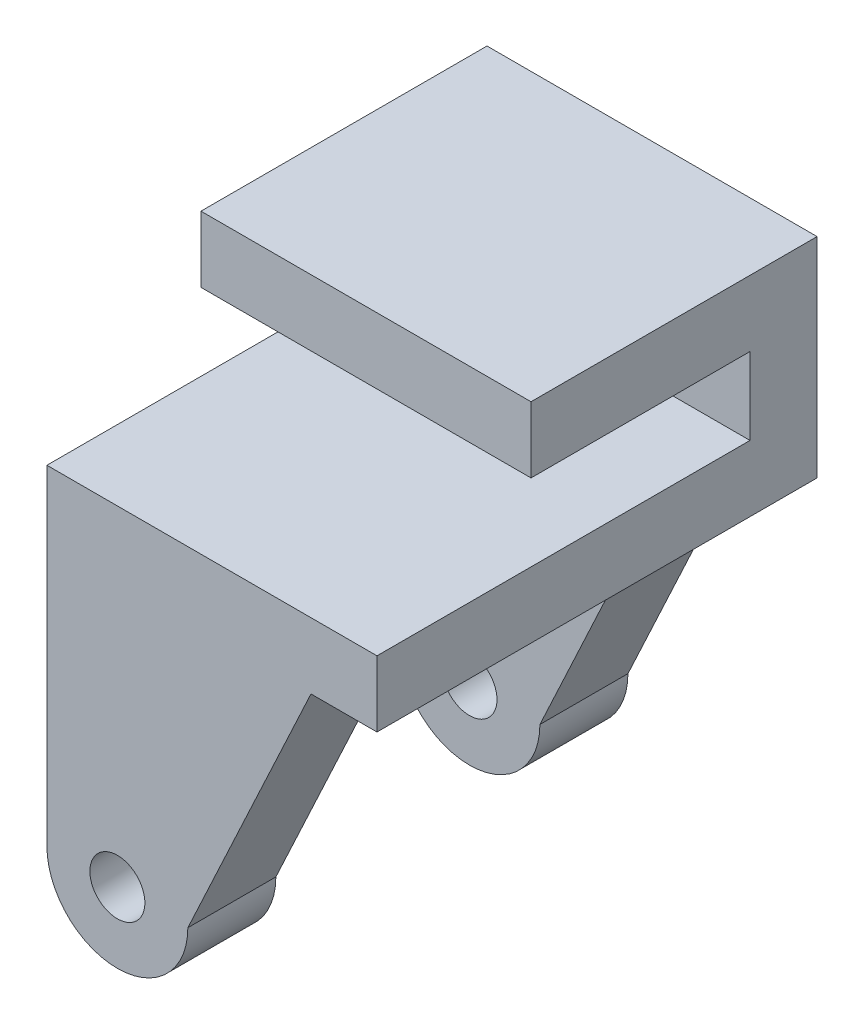
ISO-10303-21;
HEADER;
FILE_DESCRIPTION(('STEP AP214'),'2;1');
FILE_NAME('part.step','',(''),(''),'','','');
FILE_SCHEMA(('AUTOMOTIVE_DESIGN { 1 0 10303 214 1 1 1 1 }'));
ENDSEC;
DATA;
#1=APPLICATION_CONTEXT('core data for automotive mechanical design processes');
#2=APPLICATION_PROTOCOL_DEFINITION('international standard','automotive_design',2000,#1);
#3=PRODUCT_CONTEXT('',#1,'mechanical');
#4=PRODUCT('Part','Part','',(#3));
#5=PRODUCT_RELATED_PRODUCT_CATEGORY('part','',(#4));
#6=PRODUCT_DEFINITION_FORMATION('','',#4);
#7=PRODUCT_DEFINITION_CONTEXT('part definition',#1,'design');
#8=PRODUCT_DEFINITION('design','',#6,#7);
#9=PRODUCT_DEFINITION_SHAPE('','',#8);
#10=(LENGTH_UNIT() NAMED_UNIT(*) SI_UNIT(.MILLI.,.METRE.));
#11=(NAMED_UNIT(*) PLANE_ANGLE_UNIT() SI_UNIT($,.RADIAN.));
#12=(NAMED_UNIT(*) SI_UNIT($,.STERADIAN.) SOLID_ANGLE_UNIT());
#13=UNCERTAINTY_MEASURE_WITH_UNIT(LENGTH_MEASURE(1.E-05),#10,'distance_accuracy_value','');
#14=(GEOMETRIC_REPRESENTATION_CONTEXT(3) GLOBAL_UNCERTAINTY_ASSIGNED_CONTEXT((#13)) GLOBAL_UNIT_ASSIGNED_CONTEXT((#10,
#11,#12)) REPRESENTATION_CONTEXT('',''));
#15=CARTESIAN_POINT('',(0.,0.,0.));
#16=DIRECTION('',(0.,0.,1.));
#17=DIRECTION('',(1.,0.,0.));
#18=AXIS2_PLACEMENT_3D('',#15,#16,#17);
#19=CARTESIAN_POINT('',(15.,0.,0.));
#20=DIRECTION('',(0.,1.,0.));
#21=DIRECTION('',(0.,0.,1.));
#22=AXIS2_PLACEMENT_3D('',#19,#20,#21);
#23=PLANE('',#22);
#24=DIRECTION('',(0.,0.,-1.));
#25=VECTOR('',#24,1.);
#26=CARTESIAN_POINT('',(15.,0.,0.));
#27=LINE('',#26,#25);
#28=CARTESIAN_POINT('',(15.,0.,-20.));
#29=VERTEX_POINT('',#28);
#30=CARTESIAN_POINT('',(15.,0.,-40.));
#31=VERTEX_POINT('',#30);
#32=EDGE_CURVE('E11',#29,#31,#27,.T.);
#33=ORIENTED_EDGE('',*,*,#32,.F.);
#34=DIRECTION('',(-1.,0.,0.));
#35=VECTOR('',#34,1.);
#36=CARTESIAN_POINT('',(15.,0.,-20.));
#37=LINE('',#36,#35);
#38=CARTESIAN_POINT('',(12.,0.,-20.));
#39=VERTEX_POINT('',#38);
#40=EDGE_CURVE('E152',#29,#39,#37,.T.);
#41=ORIENTED_EDGE('',*,*,#40,.T.);
#42=DIRECTION('',(0.,0.,-1.));
#43=VECTOR('',#42,1.);
#44=CARTESIAN_POINT('',(12.,0.,-16.));
#45=LINE('',#44,#43);
#46=CARTESIAN_POINT('',(12.,0.,-24.));
#47=VERTEX_POINT('',#46);
#48=EDGE_CURVE('E162',#39,#47,#45,.T.);
#49=ORIENTED_EDGE('',*,*,#48,.T.);
#50=DIRECTION('',(-1.,0.,0.));
#51=VECTOR('',#50,1.);
#52=CARTESIAN_POINT('',(0.,0.,-24.));
#53=LINE('',#52,#51);
#54=CARTESIAN_POINT('',(0.,0.,-24.));
#55=VERTEX_POINT('',#54);
#56=EDGE_CURVE('E259',#47,#55,#53,.T.);
#57=ORIENTED_EDGE('',*,*,#56,.T.);
#58=DIRECTION('',(0.,0.,1.));
#59=VECTOR('',#58,1.);
#60=CARTESIAN_POINT('',(0.,0.,-40.));
#61=LINE('',#60,#59);
#62=CARTESIAN_POINT('',(0.,0.,-36.));
#63=VERTEX_POINT('',#62);
#64=EDGE_CURVE('E234',#63,#55,#61,.T.);
#65=ORIENTED_EDGE('',*,*,#64,.F.);
#66=DIRECTION('',(-1.,0.,0.));
#67=VECTOR('',#66,1.);
#68=CARTESIAN_POINT('',(0.,0.,-36.));
#69=LINE('',#68,#67);
#70=CARTESIAN_POINT('',(12.,0.,-36.));
#71=VERTEX_POINT('',#70);
#72=EDGE_CURVE('E277',#71,#63,#69,.T.);
#73=ORIENTED_EDGE('',*,*,#72,.F.);
#74=DIRECTION('',(0.,0.,-1.));
#75=VECTOR('',#74,1.);
#76=CARTESIAN_POINT('',(12.,0.,-36.));
#77=LINE('',#76,#75);
#78=CARTESIAN_POINT('',(12.,0.,-40.));
#79=VERTEX_POINT('',#78);
#80=EDGE_CURVE('E291',#71,#79,#77,.T.);
#81=ORIENTED_EDGE('',*,*,#80,.T.);
#82=DIRECTION('',(-1.,0.,0.));
#83=VECTOR('',#82,1.);
#84=CARTESIAN_POINT('',(15.,0.,-40.));
#85=LINE('',#84,#83);
#86=EDGE_CURVE('E181',#31,#79,#85,.T.);
#87=ORIENTED_EDGE('',*,*,#86,.F.);
#88=EDGE_LOOP('',(#33,#41,#49,#57,#65,#73,#81,#87));
#89=FACE_BOUND('',#88,.T.);
#90=ADVANCED_FACE('F39',(#89),#23,.F.);
#91=CARTESIAN_POINT('',(15.,0.,0.));
#92=DIRECTION('',(-1.,0.,0.));
#93=DIRECTION('',(0.,0.,1.));
#94=AXIS2_PLACEMENT_3D('',#91,#92,#93);
#95=PLANE('',#94);
#96=DIRECTION('',(0.,0.,1.));
#97=VECTOR('',#96,1.);
#98=CARTESIAN_POINT('',(15.,3.,0.));
#99=LINE('',#98,#97);
#100=CARTESIAN_POINT('',(15.,3.,-36.9524790088301));
#101=VERTEX_POINT('',#100);
#102=CARTESIAN_POINT('',(15.,3.,-20.));
#103=VERTEX_POINT('',#102);
#104=EDGE_CURVE('E48',#101,#103,#99,.T.);
#105=ORIENTED_EDGE('',*,*,#104,.T.);
#106=DIRECTION('',(0.,-1.,0.));
#107=VECTOR('',#106,1.);
#108=CARTESIAN_POINT('',(15.,0.,-20.));
#109=LINE('',#108,#107);
#110=EDGE_CURVE('E192',#103,#29,#109,.T.);
#111=ORIENTED_EDGE('',*,*,#110,.T.);
#112=ORIENTED_EDGE('',*,*,#32,.T.);
#113=DIRECTION('',(0.,1.,0.));
#114=VECTOR('',#113,1.);
#115=CARTESIAN_POINT('',(15.,0.,-40.));
#116=LINE('',#115,#114);
#117=CARTESIAN_POINT('',(15.,9.5,-40.));
#118=VERTEX_POINT('',#117);
#119=EDGE_CURVE('E226',#31,#118,#116,.T.);
#120=ORIENTED_EDGE('',*,*,#119,.T.);
#121=DIRECTION('',(0.,0.,1.));
#122=VECTOR('',#121,1.);
#123=CARTESIAN_POINT('',(15.,9.5,-40.));
#124=LINE('',#123,#122);
#125=CARTESIAN_POINT('',(15.,9.5,-27.));
#126=VERTEX_POINT('',#125);
#127=EDGE_CURVE('E64',#118,#126,#124,.T.);
#128=ORIENTED_EDGE('',*,*,#127,.T.);
#129=DIRECTION('',(0.,1.,0.));
#130=VECTOR('',#129,1.);
#131=CARTESIAN_POINT('',(15.,0.,-27.));
#132=LINE('',#131,#130);
#133=CARTESIAN_POINT('',(15.,6.5,-27.));
#134=VERTEX_POINT('',#133);
#135=EDGE_CURVE('E216',#134,#126,#132,.T.);
#136=ORIENTED_EDGE('',*,*,#135,.F.);
#137=DIRECTION('',(0.,0.,1.));
#138=VECTOR('',#137,1.);
#139=CARTESIAN_POINT('',(15.,6.5,0.));
#140=LINE('',#139,#138);
#141=CARTESIAN_POINT('',(15.,6.5,-36.9524790088301));
#142=VERTEX_POINT('',#141);
#143=EDGE_CURVE('E222',#142,#134,#140,.T.);
#144=ORIENTED_EDGE('',*,*,#143,.F.);
#145=DIRECTION('',(0.,1.,0.));
#146=VECTOR('',#145,1.);
#147=CARTESIAN_POINT('',(15.,0.,-36.9524790088301));
#148=LINE('',#147,#146);
#149=EDGE_CURVE('E82',#101,#142,#148,.T.);
#150=ORIENTED_EDGE('',*,*,#149,.F.);
#151=EDGE_LOOP('',(#105,#111,#112,#120,#128,#136,#144,#150));
#152=FACE_BOUND('',#151,.T.);
#153=ADVANCED_FACE('F191',(#152),#95,.F.);
#154=CARTESIAN_POINT('',(0.,0.,0.));
#155=DIRECTION('',(-1.,0.,0.));
#156=DIRECTION('',(0.,0.,1.));
#157=AXIS2_PLACEMENT_3D('',#154,#155,#156);
#158=PLANE('',#157);
#159=DIRECTION('',(0.,-1.,0.));
#160=VECTOR('',#159,1.);
#161=CARTESIAN_POINT('',(0.,0.,-20.));
#162=LINE('',#161,#160);
#163=CARTESIAN_POINT('',(0.,3.,-20.));
#164=VERTEX_POINT('',#163);
#165=CARTESIAN_POINT('',(0.,-12.,-20.));
#166=VERTEX_POINT('',#165);
#167=EDGE_CURVE('E167',#164,#166,#162,.T.);
#168=ORIENTED_EDGE('',*,*,#167,.F.);
#169=DIRECTION('',(0.,0.,-1.));
#170=VECTOR('',#169,1.);
#171=CARTESIAN_POINT('',(0.,3.,-20.));
#172=LINE('',#171,#170);
#173=CARTESIAN_POINT('',(0.,3.,-36.9524790088301));
#174=VERTEX_POINT('',#173);
#175=EDGE_CURVE('E185',#164,#174,#172,.T.);
#176=ORIENTED_EDGE('',*,*,#175,.T.);
#177=DIRECTION('',(0.,-1.,0.));
#178=VECTOR('',#177,1.);
#179=CARTESIAN_POINT('',(0.,3.,-36.9524790088301));
#180=LINE('',#179,#178);
#181=CARTESIAN_POINT('',(0.,6.5,-36.9524790088301));
#182=VERTEX_POINT('',#181);
#183=EDGE_CURVE('E203',#182,#174,#180,.T.);
#184=ORIENTED_EDGE('',*,*,#183,.F.);
#185=DIRECTION('',(0.,0.,-1.));
#186=VECTOR('',#185,1.);
#187=CARTESIAN_POINT('',(0.,6.5,-27.));
#188=LINE('',#187,#186);
#189=CARTESIAN_POINT('',(0.,6.5,-27.));
#190=VERTEX_POINT('',#189);
#191=EDGE_CURVE('E212',#190,#182,#188,.T.);
#192=ORIENTED_EDGE('',*,*,#191,.F.);
#193=DIRECTION('',(0.,-1.,0.));
#194=VECTOR('',#193,1.);
#195=CARTESIAN_POINT('',(0.,6.5,-27.));
#196=LINE('',#195,#194);
#197=CARTESIAN_POINT('',(0.,9.5,-27.));
#198=VERTEX_POINT('',#197);
#199=EDGE_CURVE('E206',#198,#190,#196,.T.);
#200=ORIENTED_EDGE('',*,*,#199,.F.);
#201=DIRECTION('',(0.,0.,1.));
#202=VECTOR('',#201,1.);
#203=CARTESIAN_POINT('',(0.,9.5,-40.));
#204=LINE('',#203,#202);
#205=CARTESIAN_POINT('',(0.,9.5,-40.));
#206=VERTEX_POINT('',#205);
#207=EDGE_CURVE('E75',#206,#198,#204,.T.);
#208=ORIENTED_EDGE('',*,*,#207,.F.);
#209=DIRECTION('',(0.,1.,0.));
#210=VECTOR('',#209,1.);
#211=CARTESIAN_POINT('',(0.,0.,-40.));
#212=LINE('',#211,#210);
#213=CARTESIAN_POINT('',(0.,-12.,-40.));
#214=VERTEX_POINT('',#213);
#215=EDGE_CURVE('E225',#214,#206,#212,.T.);
#216=ORIENTED_EDGE('',*,*,#215,.F.);
#217=DIRECTION('',(0.,0.,-1.));
#218=VECTOR('',#217,1.);
#219=CARTESIAN_POINT('',(0.,-12.,-36.));
#220=LINE('',#219,#218);
#221=CARTESIAN_POINT('',(0.,-12.,-36.));
#222=VERTEX_POINT('',#221);
#223=EDGE_CURVE('E296',#222,#214,#220,.T.);
#224=ORIENTED_EDGE('',*,*,#223,.F.);
#225=DIRECTION('',(0.,-1.,0.));
#226=VECTOR('',#225,1.);
#227=CARTESIAN_POINT('',(0.,0.,-36.));
#228=LINE('',#227,#226);
#229=EDGE_CURVE('E288',#63,#222,#228,.T.);
#230=ORIENTED_EDGE('',*,*,#229,.F.);
#231=ORIENTED_EDGE('',*,*,#64,.T.);
#232=DIRECTION('',(0.,-1.,0.));
#233=VECTOR('',#232,1.);
#234=CARTESIAN_POINT('',(0.,0.,-24.));
#235=LINE('',#234,#233);
#236=CARTESIAN_POINT('',(0.,-12.,-24.));
#237=VERTEX_POINT('',#236);
#238=EDGE_CURVE('E253',#55,#237,#235,.T.);
#239=ORIENTED_EDGE('',*,*,#238,.T.);
#240=DIRECTION('',(0.,0.,-1.));
#241=VECTOR('',#240,1.);
#242=CARTESIAN_POINT('',(0.,-12.,-16.));
#243=LINE('',#242,#241);
#244=EDGE_CURVE('E179',#166,#237,#243,.T.);
#245=ORIENTED_EDGE('',*,*,#244,.F.);
#246=EDGE_LOOP('',(#168,#176,#184,#192,#200,#208,#216,#224,#230,#231,#239,#245));
#247=FACE_BOUND('',#246,.T.);
#248=ADVANCED_FACE('F256',(#247),#158,.T.);
#249=CARTESIAN_POINT('',(15.,9.5,-40.));
#250=DIRECTION('',(0.,-1.,0.));
#251=DIRECTION('',(0.,0.,-1.));
#252=AXIS2_PLACEMENT_3D('',#249,#250,#251);
#253=PLANE('',#252);
#254=DIRECTION('',(1.,0.,0.));
#255=VECTOR('',#254,1.);
#256=CARTESIAN_POINT('',(0.,9.5,-27.));
#257=LINE('',#256,#255);
#258=EDGE_CURVE('E219',#198,#126,#257,.T.);
#259=ORIENTED_EDGE('',*,*,#258,.T.);
#260=ORIENTED_EDGE('',*,*,#127,.F.);
#261=DIRECTION('',(-1.,0.,0.));
#262=VECTOR('',#261,1.);
#263=CARTESIAN_POINT('',(15.,9.5,-40.));
#264=LINE('',#263,#262);
#265=EDGE_CURVE('E175',#118,#206,#264,.T.);
#266=ORIENTED_EDGE('',*,*,#265,.T.);
#267=ORIENTED_EDGE('',*,*,#207,.T.);
#268=EDGE_LOOP('',(#259,#260,#266,#267));
#269=FACE_BOUND('',#268,.T.);
#270=ADVANCED_FACE('F326',(#269),#253,.F.);
#271=CARTESIAN_POINT('',(0.,3.,-20.));
#272=DIRECTION('',(0.,-1.,0.));
#273=DIRECTION('',(0.,0.,-1.));
#274=AXIS2_PLACEMENT_3D('',#271,#272,#273);
#275=PLANE('',#274);
#276=ORIENTED_EDGE('',*,*,#175,.F.);
#277=DIRECTION('',(1.,0.,0.));
#278=VECTOR('',#277,1.);
#279=CARTESIAN_POINT('',(0.,3.,-20.));
#280=LINE('',#279,#278);
#281=EDGE_CURVE('E166',#164,#103,#280,.T.);
#282=ORIENTED_EDGE('',*,*,#281,.T.);
#283=ORIENTED_EDGE('',*,*,#104,.F.);
#284=DIRECTION('',(1.,0.,0.));
#285=VECTOR('',#284,1.);
#286=CARTESIAN_POINT('',(0.,3.,-36.9524790088301));
#287=LINE('',#286,#285);
#288=EDGE_CURVE('E199',#174,#101,#287,.T.);
#289=ORIENTED_EDGE('',*,*,#288,.F.);
#290=EDGE_LOOP('',(#276,#282,#283,#289));
#291=FACE_BOUND('',#290,.T.);
#292=ADVANCED_FACE('F198',(#291),#275,.F.);
#293=CARTESIAN_POINT('',(3.20215405107003,-12.,-16.));
#294=DIRECTION('',(0.,0.,-1.));
#295=DIRECTION('',(-1.,0.,0.));
#296=AXIS2_PLACEMENT_3D('',#293,#294,#295);
#297=CYLINDRICAL_SURFACE('',#296,3.20215405107003);
#298=DIRECTION('',(0.,0.,-1.));
#299=VECTOR('',#298,1.);
#300=CARTESIAN_POINT('',(6.40430810214006,-12.,-16.));
#301=LINE('',#300,#299);
#302=CARTESIAN_POINT('',(6.40430810214006,-12.,-20.));
#303=VERTEX_POINT('',#302);
#304=CARTESIAN_POINT('',(6.40430810214006,-12.,-24.));
#305=VERTEX_POINT('',#304);
#306=EDGE_CURVE('E174',#303,#305,#301,.T.);
#307=ORIENTED_EDGE('',*,*,#306,.F.);
#308=CARTESIAN_POINT('',(3.20215405107003,-12.,-20.));
#309=DIRECTION('',(0.,0.,-1.));
#310=DIRECTION('',(-1.,0.,0.));
#311=AXIS2_PLACEMENT_3D('',#308,#309,#310);
#312=CIRCLE('',#311,3.20215405107003);
#313=EDGE_CURVE('E55',#303,#166,#312,.T.);
#314=ORIENTED_EDGE('',*,*,#313,.T.);
#315=ORIENTED_EDGE('',*,*,#244,.T.);
#316=CARTESIAN_POINT('',(3.20215405107003,-12.,-24.));
#317=DIRECTION('',(0.,0.,1.));
#318=DIRECTION('',(1.,0.,0.));
#319=AXIS2_PLACEMENT_3D('',#316,#317,#318);
#320=CIRCLE('',#319,3.20215405107003);
#321=EDGE_CURVE('E248',#237,#305,#320,.T.);
#322=ORIENTED_EDGE('',*,*,#321,.T.);
#323=EDGE_LOOP('',(#307,#314,#315,#322));
#324=FACE_BOUND('',#323,.T.);
#325=ADVANCED_FACE('F247',(#324),#297,.T.);
#326=CARTESIAN_POINT('',(12.,0.,-16.));
#327=DIRECTION('',(-0.906307787036651,0.422618261740696,0.));
#328=DIRECTION('',(-0.422618261740697,-0.906307787036651,0.));
#329=AXIS2_PLACEMENT_3D('',#326,#327,#328);
#330=PLANE('',#329);
#331=ORIENTED_EDGE('',*,*,#48,.F.);
#332=DIRECTION('',(-0.422618261740697,-0.906307787036651,0.));
#333=VECTOR('',#332,1.);
#334=CARTESIAN_POINT('',(12.,0.,-20.));
#335=LINE('',#334,#333);
#336=EDGE_CURVE('E149',#39,#303,#335,.T.);
#337=ORIENTED_EDGE('',*,*,#336,.T.);
#338=ORIENTED_EDGE('',*,*,#306,.T.);
#339=DIRECTION('',(0.422618261740696,0.906307787036651,0.));
#340=VECTOR('',#339,1.);
#341=CARTESIAN_POINT('',(12.,0.,-24.));
#342=LINE('',#341,#340);
#343=EDGE_CURVE('E172',#305,#47,#342,.T.);
#344=ORIENTED_EDGE('',*,*,#343,.T.);
#345=EDGE_LOOP('',(#331,#337,#338,#344));
#346=FACE_BOUND('',#345,.T.);
#347=ADVANCED_FACE('F170',(#346),#330,.F.);
#348=CARTESIAN_POINT('',(3.20215405107003,-12.,-16.));
#349=DIRECTION('',(0.,0.,-1.));
#350=DIRECTION('',(-1.,0.,0.));
#351=AXIS2_PLACEMENT_3D('',#348,#349,#350);
#352=CYLINDRICAL_SURFACE('',#351,1.25);
#353=CARTESIAN_POINT('',(3.20215405107003,-12.,-20.));
#354=DIRECTION('',(0.,0.,-1.));
#355=DIRECTION('',(-1.,0.,0.));
#356=AXIS2_PLACEMENT_3D('',#353,#354,#355);
#357=CIRCLE('',#356,1.25);
#358=CARTESIAN_POINT('',(1.95215405107003,-12.,-20.));
#359=VERTEX_POINT('',#358);
#360=EDGE_CURVE('E42',#359,#359,#357,.T.);
#361=ORIENTED_EDGE('',*,*,#360,.F.);
#362=EDGE_LOOP('',(#361));
#363=FACE_BOUND('',#362,.T.);
#364=CARTESIAN_POINT('',(3.20215405107003,-12.,-24.));
#365=DIRECTION('',(0.,0.,1.));
#366=DIRECTION('',(1.,0.,0.));
#367=AXIS2_PLACEMENT_3D('',#364,#365,#366);
#368=CIRCLE('',#367,1.25);
#369=CARTESIAN_POINT('',(4.45215405107003,-12.,-24.));
#370=VERTEX_POINT('',#369);
#371=EDGE_CURVE('E262',#370,#370,#368,.T.);
#372=ORIENTED_EDGE('',*,*,#371,.F.);
#373=EDGE_LOOP('',(#372));
#374=FACE_BOUND('',#373,.T.);
#375=ADVANCED_FACE('F335',(#363,#374),#352,.F.);
#376=CARTESIAN_POINT('',(15.,0.,-40.));
#377=DIRECTION('',(0.,0.,1.));
#378=DIRECTION('',(1.,0.,0.));
#379=AXIS2_PLACEMENT_3D('',#376,#377,#378);
#380=PLANE('',#379);
#381=ORIENTED_EDGE('',*,*,#215,.T.);
#382=ORIENTED_EDGE('',*,*,#265,.F.);
#383=ORIENTED_EDGE('',*,*,#119,.F.);
#384=ORIENTED_EDGE('',*,*,#86,.T.);
#385=DIRECTION('',(0.422618261740696,0.906307787036651,0.));
#386=VECTOR('',#385,1.);
#387=CARTESIAN_POINT('',(12.,0.,-40.));
#388=LINE('',#387,#386);
#389=CARTESIAN_POINT('',(6.40430810214006,-12.,-40.));
#390=VERTEX_POINT('',#389);
#391=EDGE_CURVE('E273',#390,#79,#388,.T.);
#392=ORIENTED_EDGE('',*,*,#391,.F.);
#393=CARTESIAN_POINT('',(3.20215405107003,-12.,-40.));
#394=DIRECTION('',(0.,0.,1.));
#395=DIRECTION('',(1.,0.,0.));
#396=AXIS2_PLACEMENT_3D('',#393,#394,#395);
#397=CIRCLE('',#396,3.20215405107003);
#398=EDGE_CURVE('E282',#214,#390,#397,.T.);
#399=ORIENTED_EDGE('',*,*,#398,.F.);
#400=EDGE_LOOP('',(#381,#382,#383,#384,#392,#399));
#401=FACE_BOUND('',#400,.T.);
#402=CARTESIAN_POINT('',(3.20215405107003,-12.,-40.));
#403=DIRECTION('',(0.,0.,1.));
#404=DIRECTION('',(1.,0.,0.));
#405=AXIS2_PLACEMENT_3D('',#402,#403,#404);
#406=CIRCLE('',#405,1.25);
#407=CARTESIAN_POINT('',(4.45215405107003,-12.,-40.));
#408=VERTEX_POINT('',#407);
#409=EDGE_CURVE('E268',#408,#408,#406,.T.);
#410=ORIENTED_EDGE('',*,*,#409,.T.);
#411=EDGE_LOOP('',(#410));
#412=FACE_BOUND('',#411,.T.);
#413=ADVANCED_FACE('F323',(#401,#412),#380,.F.);
#414=CARTESIAN_POINT('',(0.,6.5,-27.));
#415=DIRECTION('',(0.,-1.,0.));
#416=DIRECTION('',(0.,0.,-1.));
#417=AXIS2_PLACEMENT_3D('',#414,#415,#416);
#418=PLANE('',#417);
#419=ORIENTED_EDGE('',*,*,#143,.T.);
#420=DIRECTION('',(1.,0.,0.));
#421=VECTOR('',#420,1.);
#422=CARTESIAN_POINT('',(0.,6.5,-27.));
#423=LINE('',#422,#421);
#424=EDGE_CURVE('E210',#190,#134,#423,.T.);
#425=ORIENTED_EDGE('',*,*,#424,.F.);
#426=ORIENTED_EDGE('',*,*,#191,.T.);
#427=DIRECTION('',(1.,0.,0.));
#428=VECTOR('',#427,1.);
#429=CARTESIAN_POINT('',(0.,6.5,-36.9524790088301));
#430=LINE('',#429,#428);
#431=EDGE_CURVE('E205',#182,#142,#430,.T.);
#432=ORIENTED_EDGE('',*,*,#431,.T.);
#433=EDGE_LOOP('',(#419,#425,#426,#432));
#434=FACE_BOUND('',#433,.T.);
#435=ADVANCED_FACE('F327',(#434),#418,.T.);
#436=CARTESIAN_POINT('',(0.,3.,-36.9524790088301));
#437=DIRECTION('',(0.,0.,1.));
#438=DIRECTION('',(0.,-1.,0.));
#439=AXIS2_PLACEMENT_3D('',#436,#437,#438);
#440=PLANE('',#439);
#441=ORIENTED_EDGE('',*,*,#149,.T.);
#442=ORIENTED_EDGE('',*,*,#431,.F.);
#443=ORIENTED_EDGE('',*,*,#183,.T.);
#444=ORIENTED_EDGE('',*,*,#288,.T.);
#445=EDGE_LOOP('',(#441,#442,#443,#444));
#446=FACE_BOUND('',#445,.T.);
#447=ADVANCED_FACE('F201',(#446),#440,.T.);
#448=CARTESIAN_POINT('',(0.,6.5,-27.));
#449=DIRECTION('',(0.,0.,1.));
#450=DIRECTION('',(1.,0.,0.));
#451=AXIS2_PLACEMENT_3D('',#448,#449,#450);
#452=PLANE('',#451);
#453=ORIENTED_EDGE('',*,*,#135,.T.);
#454=ORIENTED_EDGE('',*,*,#258,.F.);
#455=ORIENTED_EDGE('',*,*,#199,.T.);
#456=ORIENTED_EDGE('',*,*,#424,.T.);
#457=EDGE_LOOP('',(#453,#454,#455,#456));
#458=FACE_BOUND('',#457,.T.);
#459=ADVANCED_FACE('F317',(#458),#452,.T.);
#460=CARTESIAN_POINT('',(3.20215405107003,-12.,-36.));
#461=DIRECTION('',(0.,0.,-1.));
#462=DIRECTION('',(1.,0.,0.));
#463=AXIS2_PLACEMENT_3D('',#460,#461,#462);
#464=PLANE('',#463);
#465=ORIENTED_EDGE('',*,*,#72,.T.);
#466=ORIENTED_EDGE('',*,*,#229,.T.);
#467=CARTESIAN_POINT('',(3.20215405107003,-12.,-36.));
#468=DIRECTION('',(0.,0.,1.));
#469=DIRECTION('',(1.,0.,0.));
#470=AXIS2_PLACEMENT_3D('',#467,#468,#469);
#471=CIRCLE('',#470,3.20215405107003);
#472=CARTESIAN_POINT('',(6.40430810214006,-12.,-36.));
#473=VERTEX_POINT('',#472);
#474=EDGE_CURVE('E285',#222,#473,#471,.T.);
#475=ORIENTED_EDGE('',*,*,#474,.T.);
#476=DIRECTION('',(0.422618261740696,0.906307787036651,0.));
#477=VECTOR('',#476,1.);
#478=CARTESIAN_POINT('',(12.,0.,-36.));
#479=LINE('',#478,#477);
#480=EDGE_CURVE('E281',#473,#71,#479,.T.);
#481=ORIENTED_EDGE('',*,*,#480,.T.);
#482=EDGE_LOOP('',(#465,#466,#475,#481));
#483=FACE_BOUND('',#482,.T.);
#484=CARTESIAN_POINT('',(3.20215405107003,-12.,-36.));
#485=DIRECTION('',(0.,0.,1.));
#486=DIRECTION('',(1.,0.,0.));
#487=AXIS2_PLACEMENT_3D('',#484,#485,#486);
#488=CIRCLE('',#487,1.25);
#489=CARTESIAN_POINT('',(4.45215405107003,-12.,-36.));
#490=VERTEX_POINT('',#489);
#491=EDGE_CURVE('E269',#490,#490,#488,.T.);
#492=ORIENTED_EDGE('',*,*,#491,.F.);
#493=EDGE_LOOP('',(#492));
#494=FACE_BOUND('',#493,.T.);
#495=ADVANCED_FACE('F404',(#483,#494),#464,.F.);
#496=CARTESIAN_POINT('',(3.20215405107003,-12.,-36.));
#497=DIRECTION('',(0.,0.,-1.));
#498=DIRECTION('',(-1.,0.,0.));
#499=AXIS2_PLACEMENT_3D('',#496,#497,#498);
#500=CYLINDRICAL_SURFACE('',#499,3.20215405107003);
#501=ORIENTED_EDGE('',*,*,#398,.T.);
#502=DIRECTION('',(0.,0.,-1.));
#503=VECTOR('',#502,1.);
#504=CARTESIAN_POINT('',(6.40430810214006,-12.,-36.));
#505=LINE('',#504,#503);
#506=EDGE_CURVE('E300',#473,#390,#505,.T.);
#507=ORIENTED_EDGE('',*,*,#506,.F.);
#508=ORIENTED_EDGE('',*,*,#474,.F.);
#509=ORIENTED_EDGE('',*,*,#223,.T.);
#510=EDGE_LOOP('',(#501,#507,#508,#509));
#511=FACE_BOUND('',#510,.T.);
#512=ADVANCED_FACE('F412',(#511),#500,.T.);
#513=CARTESIAN_POINT('',(12.,0.,-36.));
#514=DIRECTION('',(-0.906307787036651,0.422618261740696,0.));
#515=DIRECTION('',(-0.422618261740697,-0.906307787036651,0.));
#516=AXIS2_PLACEMENT_3D('',#513,#514,#515);
#517=PLANE('',#516);
#518=ORIENTED_EDGE('',*,*,#391,.T.);
#519=ORIENTED_EDGE('',*,*,#80,.F.);
#520=ORIENTED_EDGE('',*,*,#480,.F.);
#521=ORIENTED_EDGE('',*,*,#506,.T.);
#522=EDGE_LOOP('',(#518,#519,#520,#521));
#523=FACE_BOUND('',#522,.T.);
#524=ADVANCED_FACE('F422',(#523),#517,.F.);
#525=CARTESIAN_POINT('',(3.20215405107003,-12.,-36.));
#526=DIRECTION('',(0.,0.,-1.));
#527=DIRECTION('',(-1.,0.,0.));
#528=AXIS2_PLACEMENT_3D('',#525,#526,#527);
#529=CYLINDRICAL_SURFACE('',#528,1.25);
#530=ORIENTED_EDGE('',*,*,#491,.T.);
#531=EDGE_LOOP('',(#530));
#532=FACE_BOUND('',#531,.T.);
#533=ORIENTED_EDGE('',*,*,#409,.F.);
#534=EDGE_LOOP('',(#533));
#535=FACE_BOUND('',#534,.T.);
#536=ADVANCED_FACE('F432',(#532,#535),#529,.F.);
#537=CARTESIAN_POINT('',(3.20215405107003,-12.,-24.));
#538=DIRECTION('',(0.,0.,1.));
#539=DIRECTION('',(1.,0.,0.));
#540=AXIS2_PLACEMENT_3D('',#537,#538,#539);
#541=PLANE('',#540);
#542=ORIENTED_EDGE('',*,*,#371,.T.);
#543=EDGE_LOOP('',(#542));
#544=FACE_BOUND('',#543,.T.);
#545=ORIENTED_EDGE('',*,*,#56,.F.);
#546=ORIENTED_EDGE('',*,*,#343,.F.);
#547=ORIENTED_EDGE('',*,*,#321,.F.);
#548=ORIENTED_EDGE('',*,*,#238,.F.);
#549=EDGE_LOOP('',(#545,#546,#547,#548));
#550=FACE_BOUND('',#549,.T.);
#551=ADVANCED_FACE('F252',(#544,#550),#541,.F.);
#552=CARTESIAN_POINT('',(0.,0.,-20.));
#553=DIRECTION('',(0.,0.,-1.));
#554=DIRECTION('',(-1.,0.,0.));
#555=AXIS2_PLACEMENT_3D('',#552,#553,#554);
#556=PLANE('',#555);
#557=ORIENTED_EDGE('',*,*,#360,.T.);
#558=EDGE_LOOP('',(#557));
#559=FACE_BOUND('',#558,.T.);
#560=ORIENTED_EDGE('',*,*,#281,.F.);
#561=ORIENTED_EDGE('',*,*,#167,.T.);
#562=ORIENTED_EDGE('',*,*,#313,.F.);
#563=ORIENTED_EDGE('',*,*,#336,.F.);
#564=ORIENTED_EDGE('',*,*,#40,.F.);
#565=ORIENTED_EDGE('',*,*,#110,.F.);
#566=EDGE_LOOP('',(#560,#561,#562,#563,#564,#565));
#567=FACE_BOUND('',#566,.T.);
#568=ADVANCED_FACE('F151',(#559,#567),#556,.F.);
#569=CLOSED_SHELL('',(#90,#153,#248,#270,#292,#325,#347,#375,#413,#435,#447,#459,#495,#512,#524,
#536,#551,#568));
#570=MANIFOLD_SOLID_BREP('B2',#569);
#571=ADVANCED_BREP_SHAPE_REPRESENTATION('',(#18,#570),#14);
#572=SHAPE_DEFINITION_REPRESENTATION(#9,#571);
ENDSEC;
END-ISO-10303-21;
